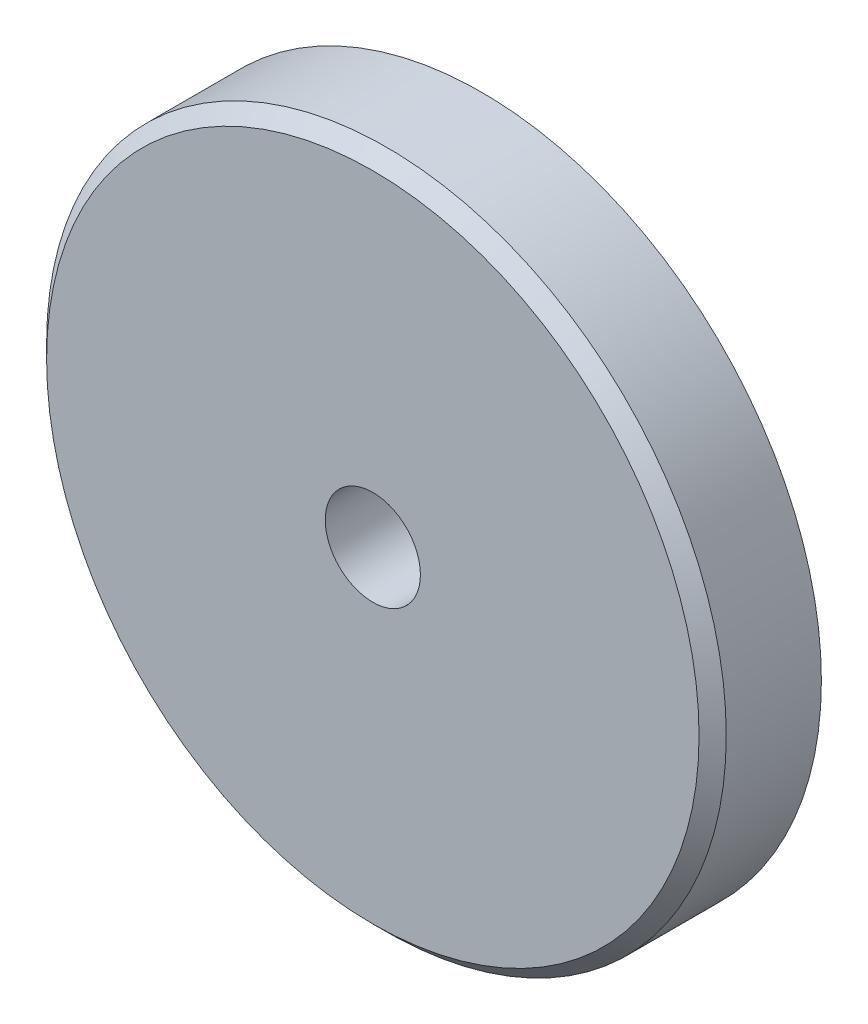
ISO-10303-21;
HEADER;
FILE_DESCRIPTION(('STEP AP214'),'2;1');
FILE_NAME('part.step','',(''),(''),'','','');
FILE_SCHEMA(('AUTOMOTIVE_DESIGN { 1 0 10303 214 1 1 1 1 }'));
ENDSEC;
DATA;
#1=APPLICATION_CONTEXT('core data for automotive mechanical design processes');
#2=APPLICATION_PROTOCOL_DEFINITION('international standard','automotive_design',2000,#1);
#3=PRODUCT_CONTEXT('',#1,'mechanical');
#4=PRODUCT('Part','Part','',(#3));
#5=PRODUCT_RELATED_PRODUCT_CATEGORY('part','',(#4));
#6=PRODUCT_DEFINITION_FORMATION('','',#4);
#7=PRODUCT_DEFINITION_CONTEXT('part definition',#1,'design');
#8=PRODUCT_DEFINITION('design','',#6,#7);
#9=PRODUCT_DEFINITION_SHAPE('','',#8);
#10=(LENGTH_UNIT() NAMED_UNIT(*) SI_UNIT(.MILLI.,.METRE.));
#11=(NAMED_UNIT(*) PLANE_ANGLE_UNIT() SI_UNIT($,.RADIAN.));
#12=(NAMED_UNIT(*) SI_UNIT($,.STERADIAN.) SOLID_ANGLE_UNIT());
#13=UNCERTAINTY_MEASURE_WITH_UNIT(LENGTH_MEASURE(1.E-05),#10,'distance_accuracy_value','');
#14=(GEOMETRIC_REPRESENTATION_CONTEXT(3) GLOBAL_UNCERTAINTY_ASSIGNED_CONTEXT((#13)) GLOBAL_UNIT_ASSIGNED_CONTEXT((#10,
#11,#12)) REPRESENTATION_CONTEXT('',''));
#15=CARTESIAN_POINT('',(0.,0.,0.));
#16=DIRECTION('',(0.,0.,1.));
#17=DIRECTION('',(1.,0.,0.));
#18=AXIS2_PLACEMENT_3D('',#15,#16,#17);
#19=CARTESIAN_POINT('',(0.,0.,4.));
#20=DIRECTION('',(0.,0.,-1.));
#21=DIRECTION('',(-1.,0.,0.));
#22=AXIS2_PLACEMENT_3D('',#19,#20,#21);
#23=CYLINDRICAL_SURFACE('',#22,12.5);
#24=CARTESIAN_POINT('',(0.,0.,3.5));
#25=DIRECTION('',(0.,0.,1.));
#26=DIRECTION('',(1.,0.,0.));
#27=AXIS2_PLACEMENT_3D('',#24,#25,#26);
#28=CIRCLE('',#27,12.5);
#29=CARTESIAN_POINT('',(12.5,0.,3.5));
#30=VERTEX_POINT('',#29);
#31=EDGE_CURVE('E10',#30,#30,#28,.F.);
#32=ORIENTED_EDGE('',*,*,#31,.T.);
#33=EDGE_LOOP('',(#32));
#34=FACE_BOUND('',#33,.T.);
#35=CARTESIAN_POINT('',(0.,0.,0.));
#36=DIRECTION('',(0.,0.,1.));
#37=DIRECTION('',(1.,0.,0.));
#38=AXIS2_PLACEMENT_3D('',#35,#36,#37);
#39=CIRCLE('',#38,12.5);
#40=CARTESIAN_POINT('',(12.5,0.,0.));
#41=VERTEX_POINT('',#40);
#42=EDGE_CURVE('E41',#41,#41,#39,.T.);
#43=ORIENTED_EDGE('',*,*,#42,.T.);
#44=EDGE_LOOP('',(#43));
#45=FACE_BOUND('',#44,.T.);
#46=ADVANCED_FACE('F30',(#34,#45),#23,.T.);
#47=CARTESIAN_POINT('',(0.,0.,4.));
#48=DIRECTION('',(0.,0.,1.));
#49=DIRECTION('',(1.,0.,0.));
#50=AXIS2_PLACEMENT_3D('',#47,#48,#49);
#51=PLANE('',#50);
#52=CARTESIAN_POINT('',(0.,0.,4.));
#53=DIRECTION('',(0.,0.,1.));
#54=DIRECTION('',(1.,0.,0.));
#55=AXIS2_PLACEMENT_3D('',#52,#53,#54);
#56=CIRCLE('',#55,1.75);
#57=CARTESIAN_POINT('',(1.75,0.,4.));
#58=VERTEX_POINT('',#57);
#59=EDGE_CURVE('E48',#58,#58,#56,.T.);
#60=ORIENTED_EDGE('',*,*,#59,.F.);
#61=EDGE_LOOP('',(#60));
#62=FACE_BOUND('',#61,.T.);
#63=CARTESIAN_POINT('',(0.,0.,4.));
#64=DIRECTION('',(0.,0.,1.));
#65=DIRECTION('',(1.,0.,0.));
#66=AXIS2_PLACEMENT_3D('',#63,#64,#65);
#67=CIRCLE('',#66,12.);
#68=CARTESIAN_POINT('',(12.,0.,4.));
#69=VERTEX_POINT('',#68);
#70=EDGE_CURVE('E37',#69,#69,#67,.T.);
#71=ORIENTED_EDGE('',*,*,#70,.T.);
#72=EDGE_LOOP('',(#71));
#73=FACE_BOUND('',#72,.T.);
#74=ADVANCED_FACE('F63',(#62,#73),#51,.T.);
#75=CARTESIAN_POINT('',(0.,0.,0.));
#76=DIRECTION('',(0.,0.,1.));
#77=DIRECTION('',(1.,0.,0.));
#78=AXIS2_PLACEMENT_3D('',#75,#76,#77);
#79=PLANE('',#78);
#80=CARTESIAN_POINT('',(0.,0.,0.));
#81=DIRECTION('',(0.,0.,1.));
#82=DIRECTION('',(1.,0.,0.));
#83=AXIS2_PLACEMENT_3D('',#80,#81,#82);
#84=CIRCLE('',#83,1.75);
#85=CARTESIAN_POINT('',(1.75,0.,0.));
#86=VERTEX_POINT('',#85);
#87=EDGE_CURVE('E45',#86,#86,#84,.T.);
#88=ORIENTED_EDGE('',*,*,#87,.T.);
#89=EDGE_LOOP('',(#88));
#90=FACE_BOUND('',#89,.T.);
#91=ORIENTED_EDGE('',*,*,#42,.F.);
#92=EDGE_LOOP('',(#91));
#93=FACE_BOUND('',#92,.T.);
#94=ADVANCED_FACE('F54',(#90,#93),#79,.F.);
#95=CARTESIAN_POINT('',(0.,0.,4.));
#96=DIRECTION('',(0.,0.,-1.));
#97=DIRECTION('',(-1.,0.,0.));
#98=AXIS2_PLACEMENT_3D('',#95,#96,#97);
#99=CONICAL_SURFACE('',#98,12.,0.78539816339745);
#100=ORIENTED_EDGE('',*,*,#31,.F.);
#101=EDGE_LOOP('',(#100));
#102=FACE_BOUND('',#101,.T.);
#103=ORIENTED_EDGE('',*,*,#70,.F.);
#104=EDGE_LOOP('',(#103));
#105=FACE_BOUND('',#104,.T.);
#106=ADVANCED_FACE('F32',(#102,#105),#99,.T.);
#107=CARTESIAN_POINT('',(0.,0.,0.));
#108=DIRECTION('',(0.,0.,1.));
#109=DIRECTION('',(1.,0.,0.));
#110=AXIS2_PLACEMENT_3D('',#107,#108,#109);
#111=CYLINDRICAL_SURFACE('',#110,1.75);
#112=ORIENTED_EDGE('',*,*,#87,.F.);
#113=EDGE_LOOP('',(#112));
#114=FACE_BOUND('',#113,.T.);
#115=ORIENTED_EDGE('',*,*,#59,.T.);
#116=EDGE_LOOP('',(#115));
#117=FACE_BOUND('',#116,.T.);
#118=ADVANCED_FACE('F57',(#114,#117),#111,.F.);
#119=CLOSED_SHELL('',(#46,#74,#94,#106,#118));
#120=MANIFOLD_SOLID_BREP('B2',#119);
#121=ADVANCED_BREP_SHAPE_REPRESENTATION('',(#18,#120),#14);
#122=SHAPE_DEFINITION_REPRESENTATION(#9,#121);
ENDSEC;
END-ISO-10303-21;
